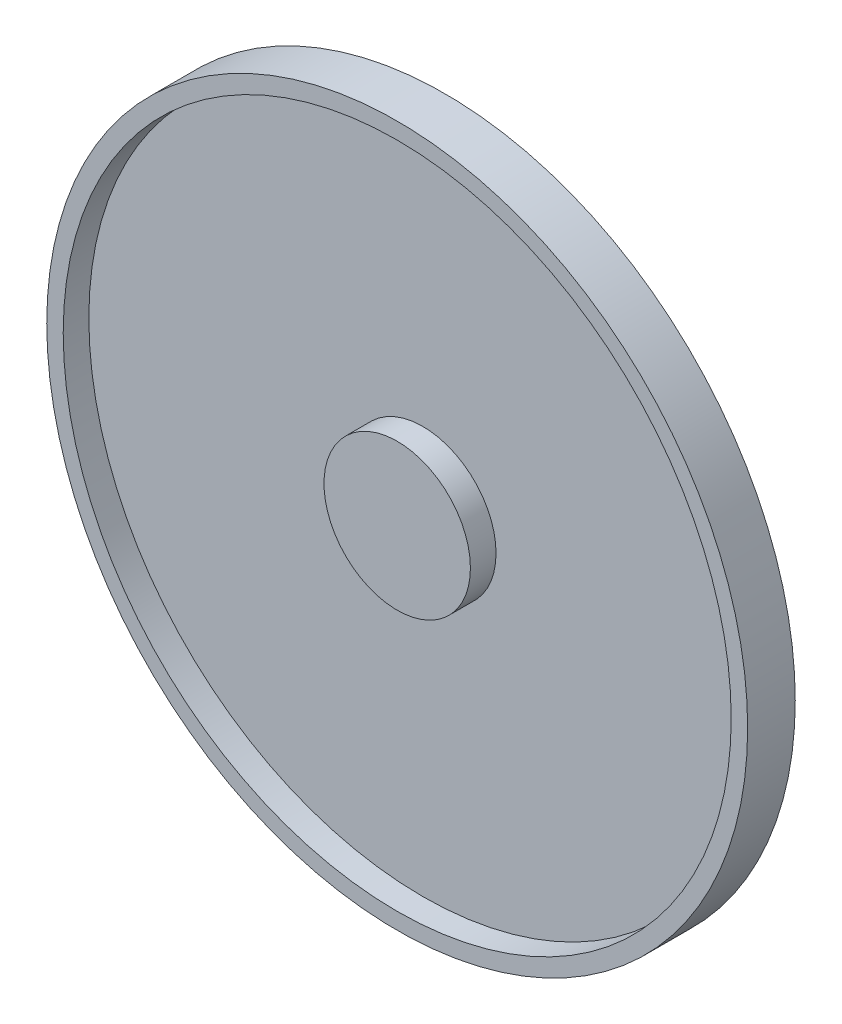
ISO-10303-21;
HEADER;
FILE_DESCRIPTION(('STEP AP214'),'2;1');
FILE_NAME('part.step','',(''),(''),'','','');
FILE_SCHEMA(('AUTOMOTIVE_DESIGN { 1 0 10303 214 1 1 1 1 }'));
ENDSEC;
DATA;
#1=APPLICATION_CONTEXT('core data for automotive mechanical design processes');
#2=APPLICATION_PROTOCOL_DEFINITION('international standard','automotive_design',2000,#1);
#3=PRODUCT_CONTEXT('',#1,'mechanical');
#4=PRODUCT('Part','Part','',(#3));
#5=PRODUCT_RELATED_PRODUCT_CATEGORY('part','',(#4));
#6=PRODUCT_DEFINITION_FORMATION('','',#4);
#7=PRODUCT_DEFINITION_CONTEXT('part definition',#1,'design');
#8=PRODUCT_DEFINITION('design','',#6,#7);
#9=PRODUCT_DEFINITION_SHAPE('','',#8);
#10=(LENGTH_UNIT() NAMED_UNIT(*) SI_UNIT(.MILLI.,.METRE.));
#11=(NAMED_UNIT(*) PLANE_ANGLE_UNIT() SI_UNIT($,.RADIAN.));
#12=(NAMED_UNIT(*) SI_UNIT($,.STERADIAN.) SOLID_ANGLE_UNIT());
#13=UNCERTAINTY_MEASURE_WITH_UNIT(LENGTH_MEASURE(1.E-05),#10,'distance_accuracy_value','');
#14=(GEOMETRIC_REPRESENTATION_CONTEXT(3) GLOBAL_UNCERTAINTY_ASSIGNED_CONTEXT((#13)) GLOBAL_UNIT_ASSIGNED_CONTEXT((#10,
#11,#12)) REPRESENTATION_CONTEXT('',''));
#15=CARTESIAN_POINT('',(0.,0.,0.));
#16=DIRECTION('',(0.,0.,1.));
#17=DIRECTION('',(1.,0.,0.));
#18=AXIS2_PLACEMENT_3D('',#15,#16,#17);
#19=CARTESIAN_POINT('',(0.,0.,-65.));
#20=DIRECTION('',(0.,0.,1.));
#21=DIRECTION('',(1.,0.,0.));
#22=AXIS2_PLACEMENT_3D('',#19,#20,#21);
#23=CYLINDRICAL_SURFACE('',#22,478.75);
#24=CARTESIAN_POINT('',(0.,0.,-65.));
#25=DIRECTION('',(0.,0.,1.));
#26=DIRECTION('',(1.,0.,0.));
#27=AXIS2_PLACEMENT_3D('',#24,#25,#26);
#28=CIRCLE('',#27,478.75);
#29=CARTESIAN_POINT('',(478.75,0.,-65.));
#30=VERTEX_POINT('',#29);
#31=EDGE_CURVE('E11',#30,#30,#28,.T.);
#32=ORIENTED_EDGE('',*,*,#31,.T.);
#33=EDGE_LOOP('',(#32));
#34=FACE_BOUND('',#33,.T.);
#35=CARTESIAN_POINT('',(0.,0.,0.));
#36=DIRECTION('',(0.,0.,1.));
#37=DIRECTION('',(1.,0.,0.));
#38=AXIS2_PLACEMENT_3D('',#35,#36,#37);
#39=CIRCLE('',#38,478.75);
#40=CARTESIAN_POINT('',(478.75,0.,0.));
#41=VERTEX_POINT('',#40);
#42=EDGE_CURVE('E45',#41,#41,#39,.T.);
#43=ORIENTED_EDGE('',*,*,#42,.F.);
#44=EDGE_LOOP('',(#43));
#45=FACE_BOUND('',#44,.T.);
#46=ADVANCED_FACE('F42',(#34,#45),#23,.T.);
#47=CARTESIAN_POINT('',(0.,0.,-65.));
#48=DIRECTION('',(0.,0.,1.));
#49=DIRECTION('',(1.,0.,0.));
#50=AXIS2_PLACEMENT_3D('',#47,#48,#49);
#51=PLANE('',#50);
#52=ORIENTED_EDGE('',*,*,#31,.F.);
#53=EDGE_LOOP('',(#52));
#54=FACE_BOUND('',#53,.T.);
#55=ADVANCED_FACE('F94',(#54),#51,.F.);
#56=CARTESIAN_POINT('',(0.,0.,0.));
#57=DIRECTION('',(0.,0.,1.));
#58=DIRECTION('',(1.,0.,0.));
#59=AXIS2_PLACEMENT_3D('',#56,#57,#58);
#60=PLANE('',#59);
#61=CARTESIAN_POINT('',(0.,0.,0.));
#62=DIRECTION('',(0.,0.,1.));
#63=DIRECTION('',(1.,0.,0.));
#64=AXIS2_PLACEMENT_3D('',#61,#62,#63);
#65=CIRCLE('',#64,456.25);
#66=CARTESIAN_POINT('',(456.25,0.,0.));
#67=VERTEX_POINT('',#66);
#68=EDGE_CURVE('E60',#67,#67,#65,.T.);
#69=ORIENTED_EDGE('',*,*,#68,.F.);
#70=EDGE_LOOP('',(#69));
#71=FACE_BOUND('',#70,.T.);
#72=ORIENTED_EDGE('',*,*,#42,.T.);
#73=EDGE_LOOP('',(#72));
#74=FACE_BOUND('',#73,.T.);
#75=ADVANCED_FACE('F89',(#71,#74),#60,.T.);
#76=CARTESIAN_POINT('',(0.,0.,-1355.46987566545));
#77=DIRECTION('',(0.,0.,1.));
#78=DIRECTION('',(1.,0.,0.));
#79=AXIS2_PLACEMENT_3D('',#76,#77,#78);
#80=CYLINDRICAL_SURFACE('',#79,456.25);
#81=CARTESIAN_POINT('',(0.,0.,-34.9999999999999));
#82=DIRECTION('',(0.,0.,1.));
#83=DIRECTION('',(1.,0.,0.));
#84=AXIS2_PLACEMENT_3D('',#81,#82,#83);
#85=CIRCLE('',#84,456.25);
#86=CARTESIAN_POINT('',(456.25,0.,-35.0000000000001));
#87=VERTEX_POINT('',#86);
#88=EDGE_CURVE('E59',#87,#87,#85,.F.);
#89=CARTESIAN_POINT('',(456.25,0.,-35.0000000000001));
#90=CARTESIAN_POINT('',(456.25,0.,-34.6354166666668));
#91=CARTESIAN_POINT('',(456.25,0.,-34.2708333333335));
#92=CARTESIAN_POINT('',(456.25,0.,-33.5416666666669));
#93=CARTESIAN_POINT('',(456.25,0.,-33.1770833333335));
#94=CARTESIAN_POINT('',(456.25,0.,-32.4479166666668));
#95=CARTESIAN_POINT('',(456.25,0.,-32.0833333333334));
#96=CARTESIAN_POINT('',(456.25,0.,-31.3541666666667));
#97=CARTESIAN_POINT('',(456.25,0.,-30.9895833333334));
#98=CARTESIAN_POINT('',(456.25,0.,-30.2604166666668));
#99=CARTESIAN_POINT('',(456.25,0.,-29.8958333333335));
#100=CARTESIAN_POINT('',(456.25,0.,-29.1666666666669));
#101=CARTESIAN_POINT('',(456.25,0.,-28.8020833333335));
#102=CARTESIAN_POINT('',(456.25,0.,-28.0729166666667));
#103=CARTESIAN_POINT('',(456.25,0.,-27.7083333333334));
#104=CARTESIAN_POINT('',(456.25,0.,-26.9791666666667));
#105=CARTESIAN_POINT('',(456.25,0.,-26.6145833333334));
#106=CARTESIAN_POINT('',(456.25,0.,-25.8854166666668));
#107=CARTESIAN_POINT('',(456.25,0.,-25.5208333333335));
#108=CARTESIAN_POINT('',(456.25,0.,-24.7916666666668));
#109=CARTESIAN_POINT('',(456.25,0.,-24.4270833333335));
#110=CARTESIAN_POINT('',(456.25,0.,-23.6979166666667));
#111=CARTESIAN_POINT('',(456.25,0.,-23.3333333333334));
#112=CARTESIAN_POINT('',(456.25,0.,-22.6041666666667));
#113=CARTESIAN_POINT('',(456.25,0.,-22.2395833333334));
#114=CARTESIAN_POINT('',(456.25,0.,-21.5104166666668));
#115=CARTESIAN_POINT('',(456.25,0.,-21.1458333333335));
#116=CARTESIAN_POINT('',(456.25,0.,-20.4166666666668));
#117=CARTESIAN_POINT('',(456.25,0.,-20.0520833333335));
#118=CARTESIAN_POINT('',(456.25,0.,-19.3229166666667));
#119=CARTESIAN_POINT('',(456.25,0.,-18.9583333333333));
#120=CARTESIAN_POINT('',(456.25,0.,-18.2291666666667));
#121=CARTESIAN_POINT('',(456.25,0.,-17.8645833333334));
#122=CARTESIAN_POINT('',(456.25,0.,-17.1354166666668));
#123=CARTESIAN_POINT('',(456.25,0.,-16.7708333333335));
#124=CARTESIAN_POINT('',(456.25,0.,-16.0416666666668));
#125=CARTESIAN_POINT('',(456.25,0.,-15.6770833333334));
#126=CARTESIAN_POINT('',(456.25,0.,-14.9479166666667));
#127=CARTESIAN_POINT('',(456.25,0.,-14.5833333333333));
#128=CARTESIAN_POINT('',(456.25,0.,-13.8541666666666));
#129=CARTESIAN_POINT('',(456.25,0.,-13.4895833333334));
#130=CARTESIAN_POINT('',(456.25,0.,-12.7604166666668));
#131=CARTESIAN_POINT('',(456.25,0.,-12.3958333333335));
#132=CARTESIAN_POINT('',(456.25,0.,-11.6666666666668));
#133=CARTESIAN_POINT('',(456.25,0.,-11.3020833333334));
#134=CARTESIAN_POINT('',(456.25,0.,-10.5729166666667));
#135=CARTESIAN_POINT('',(456.25,0.,-10.2083333333333));
#136=CARTESIAN_POINT('',(456.25,0.,-9.47916666666663));
#137=CARTESIAN_POINT('',(456.25,0.,-9.11458333333333));
#138=CARTESIAN_POINT('',(456.25,0.,-8.38541666666674));
#139=CARTESIAN_POINT('',(456.25,0.,-8.02083333333344));
#140=CARTESIAN_POINT('',(456.25,0.,-7.29166666666677));
#141=CARTESIAN_POINT('',(456.25,0.,-6.9270833333334));
#142=CARTESIAN_POINT('',(456.25,0.,-6.19791666666665));
#143=CARTESIAN_POINT('',(456.25,0.,-5.83333333333328));
#144=CARTESIAN_POINT('',(456.25,0.,-5.10416666666661));
#145=CARTESIAN_POINT('',(456.25,0.,-4.73958333333332));
#146=CARTESIAN_POINT('',(456.25,0.,-4.01041666666672));
#147=CARTESIAN_POINT('',(456.25,0.,-3.64583333333342));
#148=CARTESIAN_POINT('',(456.25,0.,-2.91666666666675));
#149=CARTESIAN_POINT('',(456.25,0.,-2.55208333333338));
#150=CARTESIAN_POINT('',(456.25,0.,-1.82291666666664));
#151=CARTESIAN_POINT('',(456.25,0.,-1.45833333333327));
#152=CARTESIAN_POINT('',(456.25,0.,-0.729166666666596));
#153=CARTESIAN_POINT('',(456.25,0.,-0.364583333333298));
#154=CARTESIAN_POINT('',(456.25,0.,0.));
#155=B_SPLINE_CURVE_WITH_KNOTS('',3,(#89,#90,#91,#92,#93,#94,#95,#96,#97,#98,#99,#100,#101,#102,
#103,#104,#105,#106,#107,#108,#109,#110,#111,#112,#113,#114,#115,#116,#117,#118,#119,#120,#121,
#122,#123,#124,#125,#126,#127,#128,#129,#130,#131,#132,#133,#134,#135,#136,#137,#138,#139,#140,
#141,#142,#143,#144,#145,#146,#147,#148,#149,#150,#151,#152,#153,#154),.UNSPECIFIED.,.F.,.F.,(4,
2,2,2,2,2,2,2,2,2,2,2,2,2,2,2,2,2,2,2,2,2,2,2,2,2,2,2,2,2,2,2,4),(0.,1.09374999999989,
2.18750000000001,3.28125000000012,4.37500000000002,5.46874999999991,6.56250000000003,
7.65625000000014,8.75000000000004,9.84374999999993,10.9375,12.0312500000002,13.1250000000001,
14.2187499999999,15.3125000000001,16.4062500000002,17.5000000000001,18.59375,19.6875000000001,
20.7812500000002,21.8750000000001,22.96875,24.0625000000001,25.1562500000002,26.2500000000001,
27.34375,28.4375000000001,29.5312500000002,30.6250000000001,31.71875,32.8125000000001,
33.9062500000002,35.0000000000001),.UNSPECIFIED.);
#156=EDGE_CURVE('BSEAM72',#87,#67,#155,.T.);
#157=ORIENTED_EDGE('',*,*,#88,.T.);
#158=ORIENTED_EDGE('',*,*,#68,.T.);
#159=ORIENTED_EDGE('',*,*,#156,.T.);
#160=ORIENTED_EDGE('',*,*,#156,.F.);
#161=EDGE_LOOP('',(#157,#159,#158,#160));
#162=FACE_BOUND('',#161,.T.);
#163=ADVANCED_FACE('F72',(#162),#80,.F.);
#164=CARTESIAN_POINT('',(0.,0.,-1355.46987566545));
#165=DIRECTION('',(0.,0.,1.));
#166=DIRECTION('',(1.,0.,0.));
#167=AXIS2_PLACEMENT_3D('',#164,#165,#166);
#168=CYLINDRICAL_SURFACE('',#167,100.);
#169=CARTESIAN_POINT('',(0.,0.,-34.9999999999999));
#170=DIRECTION('',(0.,0.,1.));
#171=DIRECTION('',(1.,0.,0.));
#172=AXIS2_PLACEMENT_3D('',#169,#170,#171);
#173=CIRCLE('',#172,100.);
#174=CARTESIAN_POINT('',(100.,0.,-35.0000000000001));
#175=VERTEX_POINT('',#174);
#176=EDGE_CURVE('E54',#175,#175,#173,.F.);
#177=CARTESIAN_POINT('',(0.,0.,0.));
#178=DIRECTION('',(0.,0.,1.));
#179=DIRECTION('',(1.,0.,0.));
#180=AXIS2_PLACEMENT_3D('',#177,#178,#179);
#181=CIRCLE('',#180,100.);
#182=CARTESIAN_POINT('',(100.,0.,0.));
#183=VERTEX_POINT('',#182);
#184=EDGE_CURVE('E64',#183,#183,#181,.T.);
#185=CARTESIAN_POINT('',(100.,0.,-35.0000000000001));
#186=CARTESIAN_POINT('',(100.,0.,-34.6354166666668));
#187=CARTESIAN_POINT('',(100.,0.,-34.2708333333335));
#188=CARTESIAN_POINT('',(100.,0.,-33.5416666666669));
#189=CARTESIAN_POINT('',(100.,0.,-33.1770833333335));
#190=CARTESIAN_POINT('',(100.,0.,-32.4479166666668));
#191=CARTESIAN_POINT('',(100.,0.,-32.0833333333334));
#192=CARTESIAN_POINT('',(100.,0.,-31.3541666666667));
#193=CARTESIAN_POINT('',(100.,0.,-30.9895833333334));
#194=CARTESIAN_POINT('',(100.,0.,-30.2604166666668));
#195=CARTESIAN_POINT('',(100.,0.,-29.8958333333335));
#196=CARTESIAN_POINT('',(100.,0.,-29.1666666666669));
#197=CARTESIAN_POINT('',(100.,0.,-28.8020833333335));
#198=CARTESIAN_POINT('',(100.,0.,-28.0729166666667));
#199=CARTESIAN_POINT('',(100.,0.,-27.7083333333334));
#200=CARTESIAN_POINT('',(100.,0.,-26.9791666666667));
#201=CARTESIAN_POINT('',(100.,0.,-26.6145833333334));
#202=CARTESIAN_POINT('',(100.,0.,-25.8854166666668));
#203=CARTESIAN_POINT('',(100.,0.,-25.5208333333335));
#204=CARTESIAN_POINT('',(100.,0.,-24.7916666666668));
#205=CARTESIAN_POINT('',(100.,0.,-24.4270833333335));
#206=CARTESIAN_POINT('',(100.,0.,-23.6979166666667));
#207=CARTESIAN_POINT('',(100.,0.,-23.3333333333334));
#208=CARTESIAN_POINT('',(100.,0.,-22.6041666666667));
#209=CARTESIAN_POINT('',(100.,0.,-22.2395833333334));
#210=CARTESIAN_POINT('',(100.,0.,-21.5104166666668));
#211=CARTESIAN_POINT('',(100.,0.,-21.1458333333335));
#212=CARTESIAN_POINT('',(100.,0.,-20.4166666666668));
#213=CARTESIAN_POINT('',(100.,0.,-20.0520833333335));
#214=CARTESIAN_POINT('',(100.,0.,-19.3229166666667));
#215=CARTESIAN_POINT('',(100.,0.,-18.9583333333333));
#216=CARTESIAN_POINT('',(100.,0.,-18.2291666666667));
#217=CARTESIAN_POINT('',(100.,0.,-17.8645833333334));
#218=CARTESIAN_POINT('',(100.,0.,-17.1354166666668));
#219=CARTESIAN_POINT('',(100.,0.,-16.7708333333335));
#220=CARTESIAN_POINT('',(100.,0.,-16.0416666666668));
#221=CARTESIAN_POINT('',(100.,0.,-15.6770833333334));
#222=CARTESIAN_POINT('',(100.,0.,-14.9479166666667));
#223=CARTESIAN_POINT('',(100.,0.,-14.5833333333333));
#224=CARTESIAN_POINT('',(100.,0.,-13.8541666666666));
#225=CARTESIAN_POINT('',(100.,0.,-13.4895833333334));
#226=CARTESIAN_POINT('',(100.,0.,-12.7604166666668));
#227=CARTESIAN_POINT('',(100.,0.,-12.3958333333335));
#228=CARTESIAN_POINT('',(100.,0.,-11.6666666666668));
#229=CARTESIAN_POINT('',(100.,0.,-11.3020833333334));
#230=CARTESIAN_POINT('',(100.,0.,-10.5729166666667));
#231=CARTESIAN_POINT('',(100.,0.,-10.2083333333333));
#232=CARTESIAN_POINT('',(100.,0.,-9.47916666666663));
#233=CARTESIAN_POINT('',(100.,0.,-9.11458333333333));
#234=CARTESIAN_POINT('',(100.,0.,-8.38541666666674));
#235=CARTESIAN_POINT('',(100.,0.,-8.02083333333344));
#236=CARTESIAN_POINT('',(100.,0.,-7.29166666666677));
#237=CARTESIAN_POINT('',(100.,0.,-6.9270833333334));
#238=CARTESIAN_POINT('',(100.,0.,-6.19791666666665));
#239=CARTESIAN_POINT('',(100.,0.,-5.83333333333328));
#240=CARTESIAN_POINT('',(100.,0.,-5.10416666666661));
#241=CARTESIAN_POINT('',(100.,0.,-4.73958333333332));
#242=CARTESIAN_POINT('',(100.,0.,-4.01041666666672));
#243=CARTESIAN_POINT('',(100.,0.,-3.64583333333342));
#244=CARTESIAN_POINT('',(100.,0.,-2.91666666666675));
#245=CARTESIAN_POINT('',(100.,0.,-2.55208333333338));
#246=CARTESIAN_POINT('',(100.,0.,-1.82291666666664));
#247=CARTESIAN_POINT('',(100.,0.,-1.45833333333327));
#248=CARTESIAN_POINT('',(100.,0.,-0.729166666666596));
#249=CARTESIAN_POINT('',(100.,0.,-0.364583333333298));
#250=CARTESIAN_POINT('',(100.,0.,0.));
#251=B_SPLINE_CURVE_WITH_KNOTS('',3,(#185,#186,#187,#188,#189,#190,#191,#192,#193,#194,#195,
#196,#197,#198,#199,#200,#201,#202,#203,#204,#205,#206,#207,#208,#209,#210,#211,#212,#213,#214,
#215,#216,#217,#218,#219,#220,#221,#222,#223,#224,#225,#226,#227,#228,#229,#230,#231,#232,#233,
#234,#235,#236,#237,#238,#239,#240,#241,#242,#243,#244,#245,#246,#247,#248,#249,#250),
.UNSPECIFIED.,.F.,.F.,(4,2,2,2,2,2,2,2,2,2,2,2,2,2,2,2,2,2,2,2,2,2,2,2,2,2,2,2,2,2,2,2,4),(0.,
1.09374999999989,2.18750000000001,3.28125000000012,4.37500000000002,5.46874999999991,
6.56250000000003,7.65625000000014,8.75000000000004,9.84374999999993,10.9375,12.0312500000002,
13.1250000000001,14.2187499999999,15.3125000000001,16.4062500000002,17.5000000000001,18.59375,
19.6875000000001,20.7812500000002,21.8750000000001,22.96875,24.0625000000001,25.1562500000002,
26.2500000000001,27.34375,28.4375000000001,29.5312500000002,30.6250000000001,31.71875,
32.8125000000001,33.9062500000002,35.0000000000001),.UNSPECIFIED.);
#252=EDGE_CURVE('BSEAM79',#175,#183,#251,.T.);
#253=ORIENTED_EDGE('',*,*,#176,.F.);
#254=ORIENTED_EDGE('',*,*,#184,.F.);
#255=ORIENTED_EDGE('',*,*,#252,.T.);
#256=ORIENTED_EDGE('',*,*,#252,.F.);
#257=EDGE_LOOP('',(#253,#255,#254,#256));
#258=FACE_BOUND('',#257,.T.);
#259=ADVANCED_FACE('F79',(#258),#168,.T.);
#260=CARTESIAN_POINT('',(0.,0.,-35.));
#261=DIRECTION('',(0.,0.,1.));
#262=DIRECTION('',(1.,0.,0.));
#263=AXIS2_PLACEMENT_3D('',#260,#261,#262);
#264=PLANE('',#263);
#265=ORIENTED_EDGE('',*,*,#88,.F.);
#266=EDGE_LOOP('',(#265));
#267=FACE_BOUND('',#266,.T.);
#268=ORIENTED_EDGE('',*,*,#176,.T.);
#269=EDGE_LOOP('',(#268));
#270=FACE_BOUND('',#269,.T.);
#271=ADVANCED_FACE('F75',(#267,#270),#264,.T.);
#272=ORIENTED_EDGE('',*,*,#184,.T.);
#273=EDGE_LOOP('',(#272));
#274=FACE_BOUND('',#273,.T.);
#275=ADVANCED_FACE('F78',(#274),#60,.T.);
#276=CLOSED_SHELL('',(#46,#55,#75,#163,#259,#271,#275));
#277=MANIFOLD_SOLID_BREP('B2',#276);
#278=ADVANCED_BREP_SHAPE_REPRESENTATION('',(#18,#277),#14);
#279=SHAPE_DEFINITION_REPRESENTATION(#9,#278);
ENDSEC;
END-ISO-10303-21;
